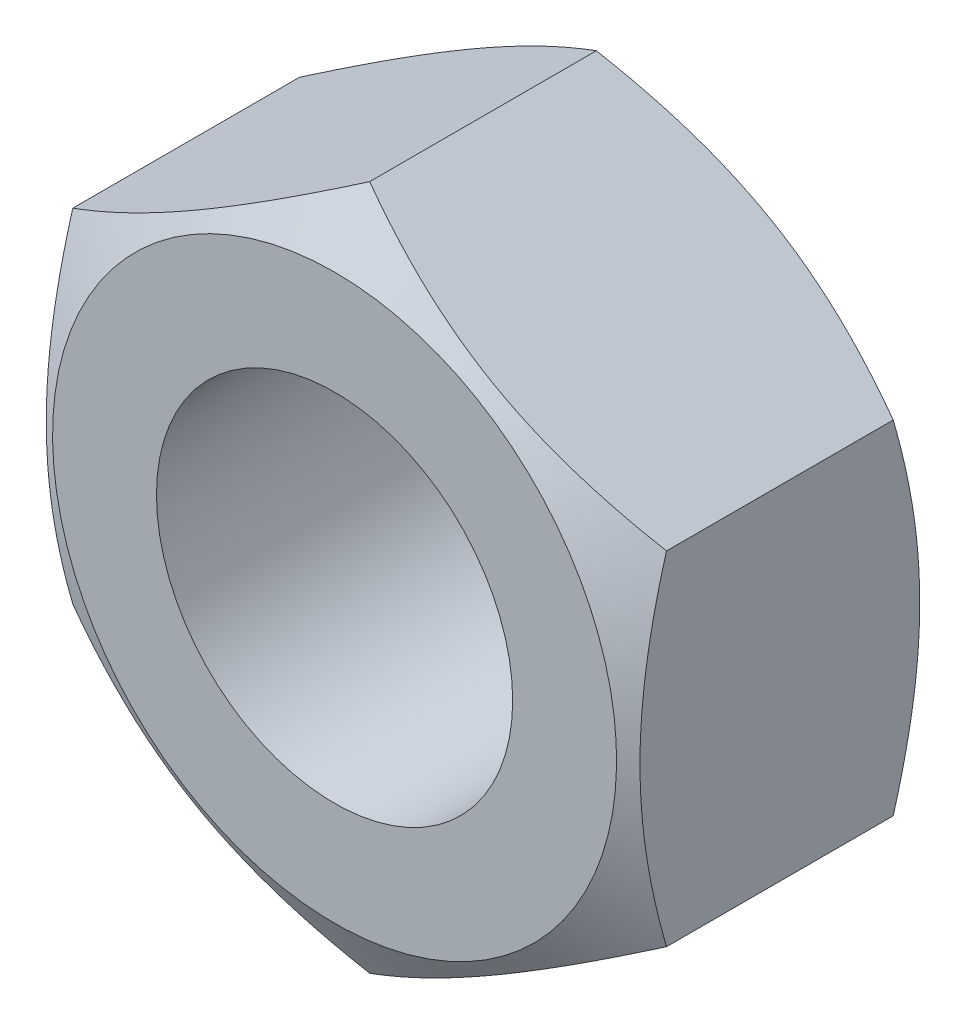
ISO-10303-21;
HEADER;
FILE_DESCRIPTION(('STEP AP214'),'2;1');
FILE_NAME('part.step','',(''),(''),'','','');
FILE_SCHEMA(('AUTOMOTIVE_DESIGN { 1 0 10303 214 1 1 1 1 }'));
ENDSEC;
DATA;
#1=APPLICATION_CONTEXT('core data for automotive mechanical design processes');
#2=APPLICATION_PROTOCOL_DEFINITION('international standard','automotive_design',2000,#1);
#3=PRODUCT_CONTEXT('',#1,'mechanical');
#4=PRODUCT('Part','Part','',(#3));
#5=PRODUCT_RELATED_PRODUCT_CATEGORY('part','',(#4));
#6=PRODUCT_DEFINITION_FORMATION('','',#4);
#7=PRODUCT_DEFINITION_CONTEXT('part definition',#1,'design');
#8=PRODUCT_DEFINITION('design','',#6,#7);
#9=PRODUCT_DEFINITION_SHAPE('','',#8);
#10=(LENGTH_UNIT() NAMED_UNIT(*) SI_UNIT(.MILLI.,.METRE.));
#11=(NAMED_UNIT(*) PLANE_ANGLE_UNIT() SI_UNIT($,.RADIAN.));
#12=(NAMED_UNIT(*) SI_UNIT($,.STERADIAN.) SOLID_ANGLE_UNIT());
#13=UNCERTAINTY_MEASURE_WITH_UNIT(LENGTH_MEASURE(1.E-05),#10,'distance_accuracy_value','');
#14=(GEOMETRIC_REPRESENTATION_CONTEXT(3) GLOBAL_UNCERTAINTY_ASSIGNED_CONTEXT((#13)) GLOBAL_UNIT_ASSIGNED_CONTEXT((#10,
#11,#12)) REPRESENTATION_CONTEXT('',''));
#15=CARTESIAN_POINT('',(0.,0.,0.));
#16=DIRECTION('',(0.,0.,1.));
#17=DIRECTION('',(1.,0.,0.));
#18=AXIS2_PLACEMENT_3D('',#15,#16,#17);
#19=CARTESIAN_POINT('',(0.,0.,1.));
#20=DIRECTION('',(0.,0.,1.));
#21=DIRECTION('',(1.,0.,0.));
#22=AXIS2_PLACEMENT_3D('',#19,#20,#21);
#23=PLANE('',#22);
#24=CARTESIAN_POINT('',(0.,0.,1.));
#25=DIRECTION('',(0.,0.,1.));
#26=DIRECTION('',(1.,0.,0.));
#27=AXIS2_PLACEMENT_3D('',#24,#25,#26);
#28=CIRCLE('',#27,0.6);
#29=CARTESIAN_POINT('',(0.6,0.,1.));
#30=VERTEX_POINT('',#29);
#31=EDGE_CURVE('E115',#30,#30,#28,.T.);
#32=ORIENTED_EDGE('',*,*,#31,.F.);
#33=EDGE_LOOP('',(#32));
#34=FACE_BOUND('',#33,.T.);
#35=CARTESIAN_POINT('',(0.,0.,1.));
#36=DIRECTION('',(0.,0.,-1.));
#37=DIRECTION('',(0.,1.,0.));
#38=AXIS2_PLACEMENT_3D('',#35,#36,#37);
#39=CIRCLE('',#38,0.95);
#40=CARTESIAN_POINT('',(0.,0.95,1.));
#41=VERTEX_POINT('',#40);
#42=EDGE_CURVE('E108',#41,#41,#39,.T.);
#43=ORIENTED_EDGE('',*,*,#42,.F.);
#44=EDGE_LOOP('',(#43));
#45=FACE_BOUND('',#44,.T.);
#46=ADVANCED_FACE('F36',(#34,#45),#23,.T.);
#47=CARTESIAN_POINT('',(0.,0.,0.));
#48=DIRECTION('',(0.,0.,1.));
#49=DIRECTION('',(1.,0.,0.));
#50=AXIS2_PLACEMENT_3D('',#47,#48,#49);
#51=PLANE('',#50);
#52=CARTESIAN_POINT('',(0.,0.,0.));
#53=DIRECTION('',(0.,0.,1.));
#54=DIRECTION('',(1.,0.,0.));
#55=AXIS2_PLACEMENT_3D('',#52,#53,#54);
#56=CIRCLE('',#55,0.6);
#57=CARTESIAN_POINT('',(0.6,0.,0.));
#58=VERTEX_POINT('',#57);
#59=EDGE_CURVE('E220',#58,#58,#56,.T.);
#60=ORIENTED_EDGE('',*,*,#59,.T.);
#61=EDGE_LOOP('',(#60));
#62=FACE_BOUND('',#61,.T.);
#63=CARTESIAN_POINT('',(0.,0.,0.));
#64=DIRECTION('',(0.,0.,-1.));
#65=DIRECTION('',(0.,1.,0.));
#66=AXIS2_PLACEMENT_3D('',#63,#64,#65);
#67=CIRCLE('',#66,0.95);
#68=CARTESIAN_POINT('',(0.,0.95,0.));
#69=VERTEX_POINT('',#68);
#70=EDGE_CURVE('E234',#69,#69,#67,.T.);
#71=ORIENTED_EDGE('',*,*,#70,.T.);
#72=EDGE_LOOP('',(#71));
#73=FACE_BOUND('',#72,.T.);
#74=ADVANCED_FACE('F136',(#62,#73),#51,.F.);
#75=CARTESIAN_POINT('',(0.,0.,1.));
#76=DIRECTION('',(0.,0.,-1.));
#77=DIRECTION('',(-1.,0.,0.));
#78=AXIS2_PLACEMENT_3D('',#75,#76,#77);
#79=CYLINDRICAL_SURFACE('',#78,0.6);
#80=ORIENTED_EDGE('',*,*,#31,.T.);
#81=EDGE_LOOP('',(#80));
#82=FACE_BOUND('',#81,.T.);
#83=ORIENTED_EDGE('',*,*,#59,.F.);
#84=EDGE_LOOP('',(#83));
#85=FACE_BOUND('',#84,.T.);
#86=ADVANCED_FACE('F227',(#82,#85),#79,.F.);
#87=CARTESIAN_POINT('',(0.,0.,0.));
#88=DIRECTION('',(0.,0.,1.));
#89=DIRECTION('',(0.,-1.,0.));
#90=AXIS2_PLACEMENT_3D('',#87,#88,#89);
#91=CONICAL_SURFACE('',#90,0.95,1.04719755119659);
#92=ORIENTED_EDGE('',*,*,#70,.F.);
#93=EDGE_LOOP('',(#92));
#94=FACE_BOUND('',#93,.T.);
#95=CARTESIAN_POINT('',(-0.000200000000000414,1.15481600843309,0.118250587602191));
#96=CARTESIAN_POINT('',(0.0437473193982796,1.12944301174833,0.103592884585671));
#97=CARTESIAN_POINT('',(0.0880739839498201,1.10385100003722,0.0902616345574185));
#98=CARTESIAN_POINT('',(0.177495074671122,1.05222370923805,0.0669904185599783));
#99=CARTESIAN_POINT('',(0.222591091201731,1.02618751195472,0.0570586874863049));
#100=CARTESIAN_POINT('',(0.312224170522619,0.97443782948051,0.0415966058186019));
#101=CARTESIAN_POINT('',(0.35674743223322,0.948732312346695,0.0359633790354762));
#102=CARTESIAN_POINT('',(0.446003739715018,0.897200159195207,0.0292351995767765));
#103=CARTESIAN_POINT('',(0.490736460481495,0.871373710819097,0.0281346788581865));
#104=CARTESIAN_POINT('',(0.574341110817347,0.823104543442188,0.0304089632346607));
#105=CARTESIAN_POINT('',(0.613225476788767,0.800654644281321,0.0332253497999321));
#106=CARTESIAN_POINT('',(0.690740844985187,0.755901125586785,0.0421563611538731));
#107=CARTESIAN_POINT('',(0.72937157856164,0.733597661157427,0.0482740446908224));
#108=CARTESIAN_POINT('',(0.807047116484145,0.68875166842842,0.0635696366623459));
#109=CARTESIAN_POINT('',(0.846082076271167,0.666214823887576,0.0728124631054832));
#110=CARTESIAN_POINT('',(0.923569381276012,0.621477507484251,0.0937907566920533));
#111=CARTESIAN_POINT('',(0.962022721293859,0.599276461273707,0.105521286070186));
#112=CARTESIAN_POINT('',(1.0002,0.577234799135789,0.11825058760219));
#113=B_SPLINE_CURVE_WITH_KNOTS('',3,(#95,#96,#97,#98,#99,#100,#101,#102,#103,#104,#105,#106,
#107,#108,#109,#110,#111,#112),.UNSPECIFIED.,.F.,.F.,(4,2,2,2,2,2,2,2,4),(0.,0.158523820030116,
0.317428970089343,0.472400167924635,0.62718093997165,0.762016584872712,0.896977373984233,
1.03493410168667,1.17261952416172),.UNSPECIFIED.);
#114=CARTESIAN_POINT('',(0.,1.15470053837925,0.118183910936524));
#115=VERTEX_POINT('',#114);
#116=CARTESIAN_POINT('',(1.,0.577350269189627,0.118183910936524));
#117=VERTEX_POINT('',#116);
#118=EDGE_CURVE('E64',#115,#117,#113,.T.);
#119=ORIENTED_EDGE('',*,*,#118,.T.);
#120=CARTESIAN_POINT('',(1.,-1.54121666272067,0.512232223493442));
#121=CARTESIAN_POINT('',(1.,-1.49761886814623,0.491120034244441));
#122=CARTESIAN_POINT('',(1.,-1.45392044066231,0.470216604721914));
#123=CARTESIAN_POINT('',(1.,-1.36626752512179,0.428935796230306));
#124=CARTESIAN_POINT('',(1.,-1.32231299713872,0.408558502130514));
#125=CARTESIAN_POINT('',(1.,-1.18951990493994,0.348168579408047));
#126=CARTESIAN_POINT('',(1.,-1.10022944290326,0.309132205738144));
#127=CARTESIAN_POINT('',(1.,-0.917136837912373,0.233999959678459));
#128=CARTESIAN_POINT('',(1.,-0.823280835377814,0.198033759199098));
#129=CARTESIAN_POINT('',(1.,-0.633178489446178,0.133435032559406));
#130=CARTESIAN_POINT('',(1.,-0.53693842862403,0.104785099774482));
#131=CARTESIAN_POINT('',(1.,-0.390725249991998,0.0708461695563724));
#132=CARTESIAN_POINT('',(1.,-0.341810918971819,0.0610533118358725));
#133=CARTESIAN_POINT('',(1.,-0.243382676508382,0.0450954055671991));
#134=CARTESIAN_POINT('',(1.,-0.193868819369176,0.038930030919713));
#135=CARTESIAN_POINT('',(1.,-0.0951320849357266,0.0307979320861008));
#136=CARTESIAN_POINT('',(1.,-0.0459137135245109,0.0287779897940663));
#137=CARTESIAN_POINT('',(1.,0.0525134313237669,0.0289633238876445));
#138=CARTESIAN_POINT('',(1.,0.101722204492277,0.0311687051478479));
#139=CARTESIAN_POINT('',(1.,0.2203589854909,0.041385668109747));
#140=CARTESIAN_POINT('',(1.,0.289611639439106,0.0514443872585718));
#141=CARTESIAN_POINT('',(1.,0.426838814210074,0.0781436990394645));
#142=CARTESIAN_POINT('',(1.,0.494811989205673,0.0947908562665079));
#143=CARTESIAN_POINT('',(1.,0.630849842204539,0.133273535191729));
#144=CARTESIAN_POINT('',(0.999999999999999,0.698883750069354,0.155214965501791));
#145=CARTESIAN_POINT('',(0.999999999999999,0.833689927885775,0.202556850415054));
#146=CARTESIAN_POINT('',(0.999999999999999,0.900462556787355,0.227956303474047));
#147=CARTESIAN_POINT('',(0.999999999999999,1.05493534490342,0.289938893910066));
#148=CARTESIAN_POINT('',(0.999999999999999,1.14226151494727,0.327444587532244));
#149=CARTESIAN_POINT('',(0.999999999999999,1.31572228115271,0.405133044991011));
#150=CARTESIAN_POINT('',(0.999999999999999,1.40185657285314,0.445316478139234));
#151=CARTESIAN_POINT('',(0.999999999999999,1.57335557091191,0.527491533248411));
#152=CARTESIAN_POINT('',(0.999999999999999,1.65871945991075,0.569484852512211));
#153=CARTESIAN_POINT('',(0.999999999999999,1.82883821519603,0.654688619165327));
#154=CARTESIAN_POINT('',(0.999999999999999,1.91359306164783,0.697899105970564));
#155=CARTESIAN_POINT('',(0.999999999999999,2.07577588980101,0.781635236483537));
#156=CARTESIAN_POINT('',(0.999999999999998,2.15323888296975,0.82209324110348));
#157=CARTESIAN_POINT('',(0.999999999999998,2.30787680390775,0.903561376071105));
#158=CARTESIAN_POINT('',(0.999999999999998,2.38505172222287,0.944571524339239));
#159=CARTESIAN_POINT('',(0.999999999999998,2.53899438906806,1.02691697848233));
#160=CARTESIAN_POINT('',(0.999999999999998,2.61576266825706,1.06825129366036));
#161=CARTESIAN_POINT('',(0.999999999999998,2.76911429586821,1.15125219653736));
#162=CARTESIAN_POINT('',(0.999999999999998,2.8456976537241,1.19291876679901));
#163=CARTESIAN_POINT('',(0.999999999999998,2.92221258406629,1.23470973588665));
#164=B_SPLINE_CURVE_WITH_KNOTS('',3,(#120,#121,#122,#123,#124,#125,#126,#127,#128,#129,#130,
#131,#132,#133,#134,#135,#136,#137,#138,#139,#140,#141,#142,#143,#144,#145,#146,#147,#148,#149,
#150,#151,#152,#153,#154,#155,#156,#157,#158,#159,#160,#161,#162,#163),.UNSPECIFIED.,.F.,.F.,(4,
2,2,2,2,2,2,2,2,2,2,2,2,2,2,2,2,2,2,2,2,4),(0.,0.145319668024172,0.290662632495735,
0.582944085346303,0.884340843151205,1.18501370278067,1.3345584807982,1.48408981315593,
1.63168917457388,1.7792921995274,1.98879752746931,2.19851213022439,2.41283206941226,
2.62709006682782,2.91213213753635,3.19724572484271,3.48263276996068,3.76802906750666,
4.03020235224485,4.29238416672727,4.55394980433369,4.81550180369994),.UNSPECIFIED.);
#165=CARTESIAN_POINT('',(1.,-0.577350269189872,0.118183910936359));
#166=VERTEX_POINT('',#165);
#167=EDGE_CURVE('E50',#117,#166,#164,.F.);
#168=ORIENTED_EDGE('',*,*,#167,.T.);
#169=CARTESIAN_POINT('',(1.0002,-0.577234799135788,0.118250587602191));
#170=CARTESIAN_POINT('',(0.95625268060172,-0.602607795820548,0.103592884585671));
#171=CARTESIAN_POINT('',(0.91192601605018,-0.628199807531658,0.0902616345574185));
#172=CARTESIAN_POINT('',(0.822504925328878,-0.679827098330831,0.0669904185599784));
#173=CARTESIAN_POINT('',(0.777408908798269,-0.705863295614159,0.0570586874863051));
#174=CARTESIAN_POINT('',(0.687775829477381,-0.757612978088368,0.0415966058186021));
#175=CARTESIAN_POINT('',(0.64325256776678,-0.783318495222184,0.0359633790354763));
#176=CARTESIAN_POINT('',(0.553996260284982,-0.834850648373672,0.0292351995767766));
#177=CARTESIAN_POINT('',(0.509263539518505,-0.860677096749782,0.0281346788581866));
#178=CARTESIAN_POINT('',(0.425658889182653,-0.908946264126691,0.0304089632346609));
#179=CARTESIAN_POINT('',(0.386774523211233,-0.931396163287558,0.0332253497999323));
#180=CARTESIAN_POINT('',(0.309259155014813,-0.976149681982094,0.0421563611538734));
#181=CARTESIAN_POINT('',(0.27062842143836,-0.998453146411451,0.0482740446908227));
#182=CARTESIAN_POINT('',(0.192952883515855,-1.04329913914046,0.0635696366623462));
#183=CARTESIAN_POINT('',(0.153917923728832,-1.0658359836813,0.0728124631054835));
#184=CARTESIAN_POINT('',(0.0764306187239882,-1.11057330008463,0.0937907566920536));
#185=CARTESIAN_POINT('',(0.0379772787061411,-1.13277434629517,0.105521286070187));
#186=CARTESIAN_POINT('',(-0.000199999999999407,-1.15481600843309,0.118250587602191));
#187=B_SPLINE_CURVE_WITH_KNOTS('',3,(#169,#170,#171,#172,#173,#174,#175,#176,#177,#178,#179,
#180,#181,#182,#183,#184,#185,#186),.UNSPECIFIED.,.F.,.F.,(4,2,2,2,2,2,2,2,4),(0.,
0.158523820030116,0.317428970089343,0.472400167924635,0.62718093997165,0.762016584872712,
0.896977373984234,1.03493410168667,1.17261952416172),.UNSPECIFIED.);
#188=CARTESIAN_POINT('',(0.,-1.15470053837925,0.118183910936524));
#189=VERTEX_POINT('',#188);
#190=EDGE_CURVE('E93',#166,#189,#187,.T.);
#191=ORIENTED_EDGE('',*,*,#190,.T.);
#192=CARTESIAN_POINT('',(0.000200000000000402,-1.15481600843309,0.118250587602191));
#193=CARTESIAN_POINT('',(-0.0437473193982797,-1.12944301174833,0.103592884585671));
#194=CARTESIAN_POINT('',(-0.0880739839498201,-1.10385100003722,0.0902616345574185));
#195=CARTESIAN_POINT('',(-0.177495074671122,-1.05222370923805,0.0669904185599783));
#196=CARTESIAN_POINT('',(-0.222591091201731,-1.02618751195472,0.0570586874863051));
#197=CARTESIAN_POINT('',(-0.312224170522619,-0.97443782948051,0.041596605818602));
#198=CARTESIAN_POINT('',(-0.35674743223322,-0.948732312346695,0.0359633790354762));
#199=CARTESIAN_POINT('',(-0.446003739715018,-0.897200159195207,0.0292351995767764));
#200=CARTESIAN_POINT('',(-0.490736460481495,-0.871373710819096,0.0281346788581865));
#201=CARTESIAN_POINT('',(-0.574341110817347,-0.823104543442188,0.0304089632346608));
#202=CARTESIAN_POINT('',(-0.613225476788767,-0.800654644281321,0.0332253497999322));
#203=CARTESIAN_POINT('',(-0.690740844985187,-0.755901125586785,0.0421563611538732));
#204=CARTESIAN_POINT('',(-0.72937157856164,-0.733597661157427,0.0482740446908225));
#205=CARTESIAN_POINT('',(-0.807047116484145,-0.68875166842842,0.063569636662346));
#206=CARTESIAN_POINT('',(-0.846082076271168,-0.666214823887576,0.0728124631054833));
#207=CARTESIAN_POINT('',(-0.923569381276012,-0.62147750748425,0.0937907566920535));
#208=CARTESIAN_POINT('',(-0.962022721293859,-0.599276461273706,0.105521286070187));
#209=CARTESIAN_POINT('',(-1.0002,-0.577234799135789,0.11825058760219));
#210=B_SPLINE_CURVE_WITH_KNOTS('',3,(#192,#193,#194,#195,#196,#197,#198,#199,#200,#201,#202,
#203,#204,#205,#206,#207,#208,#209),.UNSPECIFIED.,.F.,.F.,(4,2,2,2,2,2,2,2,4),(0.,
0.158523820030116,0.317428970089343,0.472400167924635,0.62718093997165,0.762016584872712,
0.896977373984234,1.03493410168667,1.17261952416172),.UNSPECIFIED.);
#211=CARTESIAN_POINT('',(-1.,-0.577350269189626,0.118183910936524));
#212=VERTEX_POINT('',#211);
#213=EDGE_CURVE('E107',#189,#212,#210,.T.);
#214=ORIENTED_EDGE('',*,*,#213,.T.);
#215=CARTESIAN_POINT('',(-1.,-1.54121666272067,0.512232223493442));
#216=CARTESIAN_POINT('',(-1.,-1.49761886814623,0.491120034244441));
#217=CARTESIAN_POINT('',(-1.,-1.45392044066231,0.470216604721914));
#218=CARTESIAN_POINT('',(-1.,-1.36626752512179,0.428935796230306));
#219=CARTESIAN_POINT('',(-1.,-1.32231299713872,0.408558502130514));
#220=CARTESIAN_POINT('',(-1.,-1.18951990493994,0.348168579408047));
#221=CARTESIAN_POINT('',(-1.,-1.10022944290326,0.309132205738144));
#222=CARTESIAN_POINT('',(-1.,-0.917136837912374,0.233999959678459));
#223=CARTESIAN_POINT('',(-1.,-0.823280835377815,0.198033759199098));
#224=CARTESIAN_POINT('',(-1.,-0.633178489446178,0.133435032559405));
#225=CARTESIAN_POINT('',(-1.,-0.536938428624031,0.104785099774482));
#226=CARTESIAN_POINT('',(-1.,-0.390725249991999,0.0708461695563724));
#227=CARTESIAN_POINT('',(-1.,-0.341810918971819,0.0610533118358726));
#228=CARTESIAN_POINT('',(-1.,-0.243382676508383,0.0450954055671992));
#229=CARTESIAN_POINT('',(-1.,-0.193868819369177,0.038930030919713));
#230=CARTESIAN_POINT('',(-1.,-0.0951320849357271,0.0307979320861009));
#231=CARTESIAN_POINT('',(-1.,-0.0459137135245114,0.0287779897940664));
#232=CARTESIAN_POINT('',(-1.,0.0525134313237664,0.0289633238876446));
#233=CARTESIAN_POINT('',(-1.,0.101722204492277,0.031168705147848));
#234=CARTESIAN_POINT('',(-1.,0.220358985490899,0.0413856681097471));
#235=CARTESIAN_POINT('',(-1.,0.289611639439106,0.0514443872585719));
#236=CARTESIAN_POINT('',(-1.,0.426838814210074,0.0781436990394648));
#237=CARTESIAN_POINT('',(-1.,0.494811989205673,0.0947908562665083));
#238=CARTESIAN_POINT('',(-1.,0.630849842204538,0.133273535191729));
#239=CARTESIAN_POINT('',(-1.,0.698883750069353,0.155214965501792));
#240=CARTESIAN_POINT('',(-1.,0.833689927885775,0.202556850415054));
#241=CARTESIAN_POINT('',(-1.,0.900462556787355,0.227956303474047));
#242=CARTESIAN_POINT('',(-1.,1.05493534490342,0.289938893910067));
#243=CARTESIAN_POINT('',(-1.,1.14226151494727,0.327444587532245));
#244=CARTESIAN_POINT('',(-1.,1.31572228115271,0.405133044991011));
#245=CARTESIAN_POINT('',(-1.,1.40185657285314,0.445316478139235));
#246=CARTESIAN_POINT('',(-1.,1.57335557091191,0.527491533248411));
#247=CARTESIAN_POINT('',(-1.,1.65871945991075,0.569484852512212));
#248=CARTESIAN_POINT('',(-1.,1.82883821519603,0.654688619165328));
#249=CARTESIAN_POINT('',(-1.,1.91359306164783,0.697899105970565));
#250=CARTESIAN_POINT('',(-1.,2.07577588980101,0.781635236483538));
#251=CARTESIAN_POINT('',(-1.,2.15323888296975,0.822093241103481));
#252=CARTESIAN_POINT('',(-1.,2.30787680390775,0.903561376071106));
#253=CARTESIAN_POINT('',(-1.,2.38505172222287,0.94457152433924));
#254=CARTESIAN_POINT('',(-1.,2.53899438906806,1.02691697848233));
#255=CARTESIAN_POINT('',(-1.,2.61576266825706,1.06825129366036));
#256=CARTESIAN_POINT('',(-1.,2.76911429586821,1.15125219653736));
#257=CARTESIAN_POINT('',(-1.,2.84569765372409,1.19291876679901));
#258=CARTESIAN_POINT('',(-1.,2.92221258406629,1.23470973588665));
#259=B_SPLINE_CURVE_WITH_KNOTS('',3,(#215,#216,#217,#218,#219,#220,#221,#222,#223,#224,#225,
#226,#227,#228,#229,#230,#231,#232,#233,#234,#235,#236,#237,#238,#239,#240,#241,#242,#243,#244,
#245,#246,#247,#248,#249,#250,#251,#252,#253,#254,#255,#256,#257,#258),.UNSPECIFIED.,.F.,.F.,(4,
2,2,2,2,2,2,2,2,2,2,2,2,2,2,2,2,2,2,2,2,4),(0.,0.145319668024172,0.290662632495734,
0.582944085346302,0.884340843151205,1.18501370278067,1.3345584807982,1.48408981315593,
1.63168917457388,1.7792921995274,1.98879752746931,2.19851213022439,2.41283206941226,
2.62709006682782,2.91213213753635,3.19724572484271,3.48263276996068,3.76802906750666,
4.03020235224485,4.29238416672727,4.55394980433369,4.81550180369994),.UNSPECIFIED.);
#260=CARTESIAN_POINT('',(-1.,0.577350269189626,0.118183910936524));
#261=VERTEX_POINT('',#260);
#262=EDGE_CURVE('E202',#212,#261,#259,.T.);
#263=ORIENTED_EDGE('',*,*,#262,.T.);
#264=CARTESIAN_POINT('',(-1.0002,0.577234799135788,0.118250587602191));
#265=CARTESIAN_POINT('',(-0.95625268060172,0.602607795820548,0.103592884585671));
#266=CARTESIAN_POINT('',(-0.91192601605018,0.628199807531658,0.0902616345574184));
#267=CARTESIAN_POINT('',(-0.822504925328878,0.679827098330831,0.0669904185599782));
#268=CARTESIAN_POINT('',(-0.777408908798269,0.705863295614159,0.0570586874863049));
#269=CARTESIAN_POINT('',(-0.687775829477381,0.757612978088368,0.0415966058186019));
#270=CARTESIAN_POINT('',(-0.64325256776678,0.783318495222184,0.0359633790354762));
#271=CARTESIAN_POINT('',(-0.553996260284982,0.834850648373672,0.0292351995767765));
#272=CARTESIAN_POINT('',(-0.509263539518505,0.860677096749782,0.0281346788581866));
#273=CARTESIAN_POINT('',(-0.425658889182653,0.908946264126691,0.0304089632346608));
#274=CARTESIAN_POINT('',(-0.386774523211233,0.931396163287558,0.0332253497999322));
#275=CARTESIAN_POINT('',(-0.309259155014813,0.976149681982094,0.0421563611538733));
#276=CARTESIAN_POINT('',(-0.27062842143836,0.998453146411452,0.0482740446908226));
#277=CARTESIAN_POINT('',(-0.192952883515855,1.04329913914046,0.0635696366623461));
#278=CARTESIAN_POINT('',(-0.153917923728832,1.0658359836813,0.0728124631054834));
#279=CARTESIAN_POINT('',(-0.0764306187239881,1.11057330008463,0.0937907566920536));
#280=CARTESIAN_POINT('',(-0.0379772787061411,1.13277434629517,0.105521286070187));
#281=CARTESIAN_POINT('',(0.000199999999999458,1.15481600843309,0.118250587602191));
#282=B_SPLINE_CURVE_WITH_KNOTS('',3,(#264,#265,#266,#267,#268,#269,#270,#271,#272,#273,#274,
#275,#276,#277,#278,#279,#280,#281),.UNSPECIFIED.,.F.,.F.,(4,2,2,2,2,2,2,2,4),(0.,
0.158523820030116,0.317428970089343,0.472400167924635,0.62718093997165,0.762016584872712,
0.896977373984234,1.03493410168667,1.17261952416172),.UNSPECIFIED.);
#283=EDGE_CURVE('E197',#261,#115,#282,.T.);
#284=ORIENTED_EDGE('',*,*,#283,.T.);
#285=EDGE_LOOP('',(#119,#168,#191,#214,#263,#284));
#286=FACE_BOUND('',#285,.T.);
#287=ADVANCED_FACE('F92',(#94,#286),#91,.T.);
#288=CARTESIAN_POINT('',(0.,0.,1.));
#289=DIRECTION('',(0.,0.,-1.));
#290=DIRECTION('',(0.,1.,0.));
#291=AXIS2_PLACEMENT_3D('',#288,#289,#290);
#292=CONICAL_SURFACE('',#291,0.95,1.04719755119659);
#293=ORIENTED_EDGE('',*,*,#42,.T.);
#294=EDGE_LOOP('',(#293));
#295=FACE_BOUND('',#294,.T.);
#296=CARTESIAN_POINT('',(-1.0002,0.577234799135788,0.881749412397809));
#297=CARTESIAN_POINT('',(-0.95625268060172,0.602607795820548,0.896407115414329));
#298=CARTESIAN_POINT('',(-0.91192601605018,0.628199807531658,0.909738365442582));
#299=CARTESIAN_POINT('',(-0.822504925328878,0.679827098330831,0.933009581440022));
#300=CARTESIAN_POINT('',(-0.777408908798269,0.705863295614159,0.942941312513695));
#301=CARTESIAN_POINT('',(-0.687775829477381,0.757612978088368,0.958403394181398));
#302=CARTESIAN_POINT('',(-0.64325256776678,0.783318495222184,0.964036620964524));
#303=CARTESIAN_POINT('',(-0.553996260284982,0.834850648373672,0.970764800423224));
#304=CARTESIAN_POINT('',(-0.509263539518505,0.860677096749782,0.971865321141813));
#305=CARTESIAN_POINT('',(-0.425658889182653,0.908946264126691,0.969591036765339));
#306=CARTESIAN_POINT('',(-0.386774523211233,0.931396163287558,0.966774650200068));
#307=CARTESIAN_POINT('',(-0.309259155014813,0.976149681982094,0.957843638846127));
#308=CARTESIAN_POINT('',(-0.27062842143836,0.998453146411452,0.951725955309177));
#309=CARTESIAN_POINT('',(-0.192952883515855,1.04329913914046,0.936430363337654));
#310=CARTESIAN_POINT('',(-0.153917923728832,1.0658359836813,0.927187536894516));
#311=CARTESIAN_POINT('',(-0.0764306187239882,1.11057330008463,0.906209243307946));
#312=CARTESIAN_POINT('',(-0.0379772787061412,1.13277434629517,0.894478713929813));
#313=CARTESIAN_POINT('',(0.000199999999999512,1.15481600843309,0.881749412397809));
#314=B_SPLINE_CURVE_WITH_KNOTS('',3,(#296,#297,#298,#299,#300,#301,#302,#303,#304,#305,#306,
#307,#308,#309,#310,#311,#312,#313),.UNSPECIFIED.,.F.,.F.,(4,2,2,2,2,2,2,2,4),(0.,
0.158523820030116,0.317428970089343,0.472400167924635,0.62718093997165,0.762016584872712,
0.896977373984234,1.03493410168667,1.17261952416172),.UNSPECIFIED.);
#315=CARTESIAN_POINT('',(-1.,0.577350269189626,0.881816089063476));
#316=VERTEX_POINT('',#315);
#317=CARTESIAN_POINT('',(0.,1.15470053837925,0.881816089063476));
#318=VERTEX_POINT('',#317);
#319=EDGE_CURVE('E180',#316,#318,#314,.T.);
#320=ORIENTED_EDGE('',*,*,#319,.F.);
#321=CARTESIAN_POINT('',(-1.,-1.54121666272067,0.487767776506558));
#322=CARTESIAN_POINT('',(-1.,-1.49761886814623,0.508879965755559));
#323=CARTESIAN_POINT('',(-1.,-1.45392044066231,0.529783395278086));
#324=CARTESIAN_POINT('',(-1.,-1.36626752512179,0.571064203769694));
#325=CARTESIAN_POINT('',(-1.,-1.32231299713872,0.591441497869486));
#326=CARTESIAN_POINT('',(-1.,-1.18951990493994,0.651831420591953));
#327=CARTESIAN_POINT('',(-1.,-1.10022944290326,0.690867794261856));
#328=CARTESIAN_POINT('',(-1.,-0.917136837912374,0.766000040321541));
#329=CARTESIAN_POINT('',(-1.,-0.823280835377815,0.801966240800902));
#330=CARTESIAN_POINT('',(-1.,-0.633178489446178,0.866564967440595));
#331=CARTESIAN_POINT('',(-1.,-0.536938428624031,0.895214900225518));
#332=CARTESIAN_POINT('',(-1.,-0.390725249991999,0.929153830443628));
#333=CARTESIAN_POINT('',(-1.,-0.341810918971819,0.938946688164128));
#334=CARTESIAN_POINT('',(-1.,-0.243382676508382,0.954904594432801));
#335=CARTESIAN_POINT('',(-1.,-0.193868819369176,0.961069969080287));
#336=CARTESIAN_POINT('',(-1.,-0.095132084935727,0.969202067913899));
#337=CARTESIAN_POINT('',(-1.,-0.0459137135245113,0.971222010205934));
#338=CARTESIAN_POINT('',(-1.,0.0525134313237664,0.971036676112355));
#339=CARTESIAN_POINT('',(-1.,0.101722204492277,0.968831294852152));
#340=CARTESIAN_POINT('',(-1.,0.220358985490899,0.958614331890253));
#341=CARTESIAN_POINT('',(-1.,0.289611639439106,0.948555612741428));
#342=CARTESIAN_POINT('',(-1.,0.426838814210074,0.921856300960535));
#343=CARTESIAN_POINT('',(-1.,0.494811989205673,0.905209143733492));
#344=CARTESIAN_POINT('',(-1.,0.630849842204539,0.86672646480827));
#345=CARTESIAN_POINT('',(-1.,0.698883750069354,0.844785034498208));
#346=CARTESIAN_POINT('',(-1.,0.833689927885775,0.797443149584946));
#347=CARTESIAN_POINT('',(-1.,0.900462556787355,0.772043696525952));
#348=CARTESIAN_POINT('',(-1.,1.05493534490342,0.710061106089933));
#349=CARTESIAN_POINT('',(-1.,1.14226151494727,0.672555412467755));
#350=CARTESIAN_POINT('',(-1.,1.31572228115271,0.594866955008988));
#351=CARTESIAN_POINT('',(-1.,1.40185657285314,0.554683521860765));
#352=CARTESIAN_POINT('',(-1.,1.57335557091192,0.472508466751588));
#353=CARTESIAN_POINT('',(-1.,1.65871945991075,0.430515147487787));
#354=CARTESIAN_POINT('',(-1.,1.82883821519603,0.345311380834671));
#355=CARTESIAN_POINT('',(-1.,1.91359306164784,0.302100894029434));
#356=CARTESIAN_POINT('',(-1.,2.07577588980101,0.218364763516461));
#357=CARTESIAN_POINT('',(-1.,2.15323888296975,0.177906758896519));
#358=CARTESIAN_POINT('',(-1.,2.30787680390775,0.0964386239288934));
#359=CARTESIAN_POINT('',(-1.,2.38505172222287,0.0554284756607592));
#360=CARTESIAN_POINT('',(-1.,2.53899438906806,-0.0269169784823291));
#361=CARTESIAN_POINT('',(-1.,2.61576266825706,-0.06825129366036));
#362=CARTESIAN_POINT('',(-1.,2.76911429586821,-0.151252196537365));
#363=CARTESIAN_POINT('',(-1.,2.8456976537241,-0.192918766799012));
#364=CARTESIAN_POINT('',(-1.,2.92221258406629,-0.234709735886649));
#365=B_SPLINE_CURVE_WITH_KNOTS('',3,(#321,#322,#323,#324,#325,#326,#327,#328,#329,#330,#331,
#332,#333,#334,#335,#336,#337,#338,#339,#340,#341,#342,#343,#344,#345,#346,#347,#348,#349,#350,
#351,#352,#353,#354,#355,#356,#357,#358,#359,#360,#361,#362,#363,#364),.UNSPECIFIED.,.F.,.F.,(4,
2,2,2,2,2,2,2,2,2,2,2,2,2,2,2,2,2,2,2,2,4),(0.,0.145319668024172,0.290662632495734,
0.582944085346302,0.884340843151205,1.18501370278067,1.3345584807982,1.48408981315593,
1.63168917457388,1.7792921995274,1.98879752746931,2.19851213022439,2.41283206941226,
2.62709006682782,2.91213213753636,3.19724572484272,3.48263276996068,3.76802906750666,
4.03020235224485,4.29238416672727,4.55394980433369,4.81550180369994),.UNSPECIFIED.);
#366=CARTESIAN_POINT('',(-1.,-0.577350269189626,0.881816089063476));
#367=VERTEX_POINT('',#366);
#368=EDGE_CURVE('E175',#367,#316,#365,.T.);
#369=ORIENTED_EDGE('',*,*,#368,.F.);
#370=CARTESIAN_POINT('',(0.000200000000000402,-1.15481600843309,0.88174941239781));
#371=CARTESIAN_POINT('',(-0.0437473193982796,-1.12944301174833,0.89640711541433));
#372=CARTESIAN_POINT('',(-0.0880739839498201,-1.10385100003722,0.909738365442582));
#373=CARTESIAN_POINT('',(-0.177495074671122,-1.05222370923805,0.933009581440022));
#374=CARTESIAN_POINT('',(-0.222591091201732,-1.02618751195472,0.942941312513695));
#375=CARTESIAN_POINT('',(-0.312224170522619,-0.97443782948051,0.958403394181398));
#376=CARTESIAN_POINT('',(-0.35674743223322,-0.948732312346695,0.964036620964524));
#377=CARTESIAN_POINT('',(-0.446003739715018,-0.897200159195206,0.970764800423224));
#378=CARTESIAN_POINT('',(-0.490736460481495,-0.871373710819096,0.971865321141814));
#379=CARTESIAN_POINT('',(-0.574341110817347,-0.823104543442188,0.96959103676534));
#380=CARTESIAN_POINT('',(-0.613225476788767,-0.800654644281321,0.966774650200068));
#381=CARTESIAN_POINT('',(-0.690740844985187,-0.755901125586785,0.957843638846127));
#382=CARTESIAN_POINT('',(-0.72937157856164,-0.733597661157427,0.951725955309178));
#383=CARTESIAN_POINT('',(-0.807047116484146,-0.688751668428419,0.936430363337654));
#384=CARTESIAN_POINT('',(-0.846082076271168,-0.666214823887576,0.927187536894517));
#385=CARTESIAN_POINT('',(-0.923569381276012,-0.62147750748425,0.906209243307947));
#386=CARTESIAN_POINT('',(-0.962022721293859,-0.599276461273706,0.894478713929813));
#387=CARTESIAN_POINT('',(-1.0002,-0.577234799135789,0.88174941239781));
#388=B_SPLINE_CURVE_WITH_KNOTS('',3,(#370,#371,#372,#373,#374,#375,#376,#377,#378,#379,#380,
#381,#382,#383,#384,#385,#386,#387),.UNSPECIFIED.,.F.,.F.,(4,2,2,2,2,2,2,2,4),(0.,
0.158523820030116,0.317428970089344,0.472400167924635,0.62718093997165,0.762016584872712,
0.896977373984234,1.03493410168667,1.17261952416172),.UNSPECIFIED.);
#389=CARTESIAN_POINT('',(0.,-1.15470053837925,0.881816089063476));
#390=VERTEX_POINT('',#389);
#391=EDGE_CURVE('E157',#390,#367,#388,.T.);
#392=ORIENTED_EDGE('',*,*,#391,.F.);
#393=CARTESIAN_POINT('',(1.0002,-0.577234799135788,0.881749412397809));
#394=CARTESIAN_POINT('',(0.95625268060172,-0.602607795820548,0.89640711541433));
#395=CARTESIAN_POINT('',(0.91192601605018,-0.628199807531658,0.909738365442582));
#396=CARTESIAN_POINT('',(0.822504925328878,-0.679827098330831,0.933009581440022));
#397=CARTESIAN_POINT('',(0.777408908798269,-0.705863295614159,0.942941312513695));
#398=CARTESIAN_POINT('',(0.687775829477381,-0.757612978088368,0.958403394181398));
#399=CARTESIAN_POINT('',(0.64325256776678,-0.783318495222184,0.964036620964524));
#400=CARTESIAN_POINT('',(0.553996260284982,-0.834850648373672,0.970764800423224));
#401=CARTESIAN_POINT('',(0.509263539518505,-0.860677096749782,0.971865321141814));
#402=CARTESIAN_POINT('',(0.425658889182653,-0.908946264126691,0.969591036765339));
#403=CARTESIAN_POINT('',(0.386774523211233,-0.931396163287558,0.966774650200068));
#404=CARTESIAN_POINT('',(0.309259155014813,-0.976149681982094,0.957843638846127));
#405=CARTESIAN_POINT('',(0.27062842143836,-0.998453146411451,0.951725955309178));
#406=CARTESIAN_POINT('',(0.192952883515855,-1.04329913914046,0.936430363337654));
#407=CARTESIAN_POINT('',(0.153917923728832,-1.0658359836813,0.927187536894517));
#408=CARTESIAN_POINT('',(0.0764306187239881,-1.11057330008463,0.906209243307947));
#409=CARTESIAN_POINT('',(0.0379772787061411,-1.13277434629517,0.894478713929813));
#410=CARTESIAN_POINT('',(-0.000199999999999505,-1.15481600843309,0.88174941239781));
#411=B_SPLINE_CURVE_WITH_KNOTS('',3,(#393,#394,#395,#396,#397,#398,#399,#400,#401,#402,#403,
#404,#405,#406,#407,#408,#409,#410),.UNSPECIFIED.,.F.,.F.,(4,2,2,2,2,2,2,2,4),(0.,
0.158523820030116,0.317428970089343,0.472400167924635,0.62718093997165,0.762016584872712,
0.896977373984234,1.03493410168667,1.17261952416172),.UNSPECIFIED.);
#412=CARTESIAN_POINT('',(1.,-0.577350269189626,0.881816089063476));
#413=VERTEX_POINT('',#412);
#414=EDGE_CURVE('E57',#413,#390,#411,.T.);
#415=ORIENTED_EDGE('',*,*,#414,.F.);
#416=CARTESIAN_POINT('',(1.,-1.54121666272067,0.487767776506558));
#417=CARTESIAN_POINT('',(1.,-1.49761886814623,0.508879965755559));
#418=CARTESIAN_POINT('',(1.,-1.45392044066231,0.529783395278086));
#419=CARTESIAN_POINT('',(1.,-1.36626752512179,0.571064203769694));
#420=CARTESIAN_POINT('',(1.,-1.32231299713872,0.591441497869486));
#421=CARTESIAN_POINT('',(1.,-1.18951990493994,0.651831420591953));
#422=CARTESIAN_POINT('',(1.,-1.10022944290326,0.690867794261856));
#423=CARTESIAN_POINT('',(1.,-0.917136837912373,0.766000040321541));
#424=CARTESIAN_POINT('',(1.,-0.823280835377814,0.801966240800902));
#425=CARTESIAN_POINT('',(1.,-0.633178489446178,0.866564967440595));
#426=CARTESIAN_POINT('',(1.,-0.53693842862403,0.895214900225518));
#427=CARTESIAN_POINT('',(1.,-0.390725249991998,0.929153830443628));
#428=CARTESIAN_POINT('',(1.,-0.341810918971819,0.938946688164128));
#429=CARTESIAN_POINT('',(1.,-0.243382676508382,0.954904594432801));
#430=CARTESIAN_POINT('',(1.,-0.193868819369176,0.961069969080287));
#431=CARTESIAN_POINT('',(1.,-0.0951320849357265,0.969202067913899));
#432=CARTESIAN_POINT('',(1.,-0.0459137135245108,0.971222010205934));
#433=CARTESIAN_POINT('',(1.,0.0525134313237669,0.971036676112356));
#434=CARTESIAN_POINT('',(1.,0.101722204492277,0.968831294852152));
#435=CARTESIAN_POINT('',(1.,0.2203589854909,0.958614331890253));
#436=CARTESIAN_POINT('',(1.,0.289611639439107,0.948555612741428));
#437=CARTESIAN_POINT('',(1.,0.426838814210074,0.921856300960536));
#438=CARTESIAN_POINT('',(1.,0.494811989205673,0.905209143733492));
#439=CARTESIAN_POINT('',(1.,0.630849842204538,0.866726464808271));
#440=CARTESIAN_POINT('',(0.999999999999999,0.698883750069353,0.844785034498209));
#441=CARTESIAN_POINT('',(0.999999999999999,0.833689927885774,0.797443149584946));
#442=CARTESIAN_POINT('',(0.999999999999999,0.900462556787355,0.772043696525953));
#443=CARTESIAN_POINT('',(0.999999999999999,1.05493534490342,0.710061106089934));
#444=CARTESIAN_POINT('',(0.999999999999999,1.14226151494727,0.672555412467756));
#445=CARTESIAN_POINT('',(0.999999999999999,1.31572228115271,0.594866955008989));
#446=CARTESIAN_POINT('',(0.999999999999999,1.40185657285314,0.554683521860765));
#447=CARTESIAN_POINT('',(0.999999999999999,1.57335557091192,0.472508466751589));
#448=CARTESIAN_POINT('',(0.999999999999999,1.65871945991075,0.430515147487788));
#449=CARTESIAN_POINT('',(0.999999999999999,1.82883821519603,0.345311380834672));
#450=CARTESIAN_POINT('',(0.999999999999999,1.91359306164784,0.302100894029435));
#451=CARTESIAN_POINT('',(0.999999999999999,2.07577588980101,0.218364763516462));
#452=CARTESIAN_POINT('',(0.999999999999998,2.15323888296975,0.177906758896519));
#453=CARTESIAN_POINT('',(0.999999999999998,2.30787680390775,0.0964386239288943));
#454=CARTESIAN_POINT('',(0.999999999999998,2.38505172222287,0.0554284756607602));
#455=CARTESIAN_POINT('',(0.999999999999998,2.53899438906806,-0.026916978482328));
#456=CARTESIAN_POINT('',(0.999999999999998,2.61576266825706,-0.0682512936603588));
#457=CARTESIAN_POINT('',(0.999999999999998,2.76911429586821,-0.151252196537364));
#458=CARTESIAN_POINT('',(0.999999999999998,2.8456976537241,-0.192918766799012));
#459=CARTESIAN_POINT('',(0.999999999999998,2.92221258406629,-0.234709735886649));
#460=B_SPLINE_CURVE_WITH_KNOTS('',3,(#416,#417,#418,#419,#420,#421,#422,#423,#424,#425,#426,
#427,#428,#429,#430,#431,#432,#433,#434,#435,#436,#437,#438,#439,#440,#441,#442,#443,#444,#445,
#446,#447,#448,#449,#450,#451,#452,#453,#454,#455,#456,#457,#458,#459),.UNSPECIFIED.,.F.,.F.,(4,
2,2,2,2,2,2,2,2,2,2,2,2,2,2,2,2,2,2,2,2,4),(0.,0.145319668024172,0.290662632495735,
0.582944085346303,0.884340843151205,1.18501370278067,1.3345584807982,1.48408981315593,
1.63168917457388,1.7792921995274,1.98879752746931,2.19851213022439,2.41283206941226,
2.62709006682782,2.91213213753635,3.19724572484271,3.48263276996068,3.76802906750666,
4.03020235224485,4.29238416672727,4.55394980433369,4.81550180369994),.UNSPECIFIED.);
#461=CARTESIAN_POINT('',(1.,0.577350269189627,0.881816089063476));
#462=VERTEX_POINT('',#461);
#463=EDGE_CURVE('E11',#462,#413,#460,.F.);
#464=ORIENTED_EDGE('',*,*,#463,.F.);
#465=CARTESIAN_POINT('',(-0.000200000000000414,1.15481600843309,0.881749412397809));
#466=CARTESIAN_POINT('',(0.0437473193982798,1.12944301174833,0.896407115414329));
#467=CARTESIAN_POINT('',(0.0880739839498202,1.10385100003722,0.909738365442582));
#468=CARTESIAN_POINT('',(0.177495074671122,1.05222370923805,0.933009581440022));
#469=CARTESIAN_POINT('',(0.222591091201731,1.02618751195472,0.942941312513695));
#470=CARTESIAN_POINT('',(0.312224170522619,0.97443782948051,0.958403394181398));
#471=CARTESIAN_POINT('',(0.35674743223322,0.948732312346695,0.964036620964524));
#472=CARTESIAN_POINT('',(0.446003739715018,0.897200159195207,0.970764800423223));
#473=CARTESIAN_POINT('',(0.490736460481495,0.871373710819097,0.971865321141813));
#474=CARTESIAN_POINT('',(0.574341110817347,0.823104543442188,0.969591036765339));
#475=CARTESIAN_POINT('',(0.613225476788767,0.800654644281321,0.966774650200068));
#476=CARTESIAN_POINT('',(0.690740844985187,0.755901125586785,0.957843638846127));
#477=CARTESIAN_POINT('',(0.72937157856164,0.733597661157427,0.951725955309178));
#478=CARTESIAN_POINT('',(0.807047116484146,0.68875166842842,0.936430363337654));
#479=CARTESIAN_POINT('',(0.846082076271168,0.666214823887576,0.927187536894517));
#480=CARTESIAN_POINT('',(0.923569381276012,0.621477507484251,0.906209243307946));
#481=CARTESIAN_POINT('',(0.962022721293859,0.599276461273707,0.894478713929813));
#482=CARTESIAN_POINT('',(1.0002,0.577234799135789,0.88174941239781));
#483=B_SPLINE_CURVE_WITH_KNOTS('',3,(#465,#466,#467,#468,#469,#470,#471,#472,#473,#474,#475,
#476,#477,#478,#479,#480,#481,#482),.UNSPECIFIED.,.F.,.F.,(4,2,2,2,2,2,2,2,4),(0.,
0.158523820030116,0.317428970089343,0.472400167924635,0.62718093997165,0.762016584872712,
0.896977373984234,1.03493410168667,1.17261952416172),.UNSPECIFIED.);
#484=EDGE_CURVE('E185',#318,#462,#483,.T.);
#485=ORIENTED_EDGE('',*,*,#484,.F.);
#486=EDGE_LOOP('',(#320,#369,#392,#415,#464,#485));
#487=FACE_BOUND('',#486,.T.);
#488=ADVANCED_FACE('F135',(#295,#487),#292,.T.);
#489=CARTESIAN_POINT('',(1.,-0.577350269189626,1.));
#490=DIRECTION('',(-1.,0.,0.));
#491=DIRECTION('',(0.,-1.,0.));
#492=AXIS2_PLACEMENT_3D('',#489,#490,#491);
#493=PLANE('',#492);
#494=DIRECTION('',(0.,0.,-1.));
#495=VECTOR('',#494,1.);
#496=CARTESIAN_POINT('',(1.,0.577350269189627,1.));
#497=LINE('',#496,#495);
#498=EDGE_CURVE('E111',#462,#117,#497,.T.);
#499=ORIENTED_EDGE('',*,*,#498,.F.);
#500=ORIENTED_EDGE('',*,*,#463,.T.);
#501=DIRECTION('',(0.,0.,-1.));
#502=VECTOR('',#501,1.);
#503=CARTESIAN_POINT('',(1.,-0.577350269189626,1.));
#504=LINE('',#503,#502);
#505=EDGE_CURVE('E104',#413,#166,#504,.T.);
#506=ORIENTED_EDGE('',*,*,#505,.T.);
#507=ORIENTED_EDGE('',*,*,#167,.F.);
#508=EDGE_LOOP('',(#499,#500,#506,#507));
#509=FACE_BOUND('',#508,.T.);
#510=ADVANCED_FACE('F110',(#509),#493,.F.);
#511=CARTESIAN_POINT('',(0.,-1.15470053837925,1.));
#512=DIRECTION('',(-0.5,0.866025403784439,0.));
#513=DIRECTION('',(-0.866025403784439,-0.5,0.));
#514=AXIS2_PLACEMENT_3D('',#511,#512,#513);
#515=PLANE('',#514);
#516=ORIENTED_EDGE('',*,*,#505,.F.);
#517=ORIENTED_EDGE('',*,*,#414,.T.);
#518=DIRECTION('',(0.,0.,-1.));
#519=VECTOR('',#518,1.);
#520=CARTESIAN_POINT('',(0.,-1.15470053837925,1.));
#521=LINE('',#520,#519);
#522=EDGE_CURVE('E106',#390,#189,#521,.T.);
#523=ORIENTED_EDGE('',*,*,#522,.T.);
#524=ORIENTED_EDGE('',*,*,#190,.F.);
#525=EDGE_LOOP('',(#516,#517,#523,#524));
#526=FACE_BOUND('',#525,.T.);
#527=ADVANCED_FACE('F103',(#526),#515,.F.);
#528=CARTESIAN_POINT('',(-1.,-0.577350269189626,1.));
#529=DIRECTION('',(0.5,0.866025403784439,0.));
#530=DIRECTION('',(-0.866025403784439,0.5,0.));
#531=AXIS2_PLACEMENT_3D('',#528,#529,#530);
#532=PLANE('',#531);
#533=ORIENTED_EDGE('',*,*,#522,.F.);
#534=ORIENTED_EDGE('',*,*,#391,.T.);
#535=DIRECTION('',(0.,0.,-1.));
#536=VECTOR('',#535,1.);
#537=CARTESIAN_POINT('',(-1.,-0.577350269189626,1.));
#538=LINE('',#537,#536);
#539=EDGE_CURVE('E113',#367,#212,#538,.T.);
#540=ORIENTED_EDGE('',*,*,#539,.T.);
#541=ORIENTED_EDGE('',*,*,#213,.F.);
#542=EDGE_LOOP('',(#533,#534,#540,#541));
#543=FACE_BOUND('',#542,.T.);
#544=ADVANCED_FACE('F142',(#543),#532,.F.);
#545=CARTESIAN_POINT('',(-1.,0.577350269189626,1.));
#546=DIRECTION('',(1.,0.,0.));
#547=DIRECTION('',(0.,1.,0.));
#548=AXIS2_PLACEMENT_3D('',#545,#546,#547);
#549=PLANE('',#548);
#550=ORIENTED_EDGE('',*,*,#539,.F.);
#551=ORIENTED_EDGE('',*,*,#368,.T.);
#552=DIRECTION('',(0.,0.,-1.));
#553=VECTOR('',#552,1.);
#554=CARTESIAN_POINT('',(-1.,0.577350269189626,1.));
#555=LINE('',#554,#553);
#556=EDGE_CURVE('E121',#316,#261,#555,.T.);
#557=ORIENTED_EDGE('',*,*,#556,.T.);
#558=ORIENTED_EDGE('',*,*,#262,.F.);
#559=EDGE_LOOP('',(#550,#551,#557,#558));
#560=FACE_BOUND('',#559,.T.);
#561=ADVANCED_FACE('F193',(#560),#549,.F.);
#562=CARTESIAN_POINT('',(0.,1.15470053837925,1.));
#563=DIRECTION('',(0.5,-0.866025403784438,0.));
#564=DIRECTION('',(0.866025403784438,0.5,0.));
#565=AXIS2_PLACEMENT_3D('',#562,#563,#564);
#566=PLANE('',#565);
#567=ORIENTED_EDGE('',*,*,#556,.F.);
#568=ORIENTED_EDGE('',*,*,#319,.T.);
#569=DIRECTION('',(0.,0.,-1.));
#570=VECTOR('',#569,1.);
#571=CARTESIAN_POINT('',(0.,1.15470053837925,1.));
#572=LINE('',#571,#570);
#573=EDGE_CURVE('E99',#318,#115,#572,.T.);
#574=ORIENTED_EDGE('',*,*,#573,.T.);
#575=ORIENTED_EDGE('',*,*,#283,.F.);
#576=EDGE_LOOP('',(#567,#568,#574,#575));
#577=FACE_BOUND('',#576,.T.);
#578=ADVANCED_FACE('F190',(#577),#566,.F.);
#579=CARTESIAN_POINT('',(1.,0.577350269189627,1.));
#580=DIRECTION('',(-0.5,-0.866025403784439,0.));
#581=DIRECTION('',(0.866025403784439,-0.5,0.));
#582=AXIS2_PLACEMENT_3D('',#579,#580,#581);
#583=PLANE('',#582);
#584=ORIENTED_EDGE('',*,*,#573,.F.);
#585=ORIENTED_EDGE('',*,*,#484,.T.);
#586=ORIENTED_EDGE('',*,*,#498,.T.);
#587=ORIENTED_EDGE('',*,*,#118,.F.);
#588=EDGE_LOOP('',(#584,#585,#586,#587));
#589=FACE_BOUND('',#588,.T.);
#590=ADVANCED_FACE('F38',(#589),#583,.F.);
#591=CLOSED_SHELL('',(#46,#74,#86,#287,#488,#510,#527,#544,#561,#578,#590));
#592=MANIFOLD_SOLID_BREP('B2',#591);
#593=ADVANCED_BREP_SHAPE_REPRESENTATION('',(#18,#592),#14);
#594=SHAPE_DEFINITION_REPRESENTATION(#9,#593);
ENDSEC;
END-ISO-10303-21;
